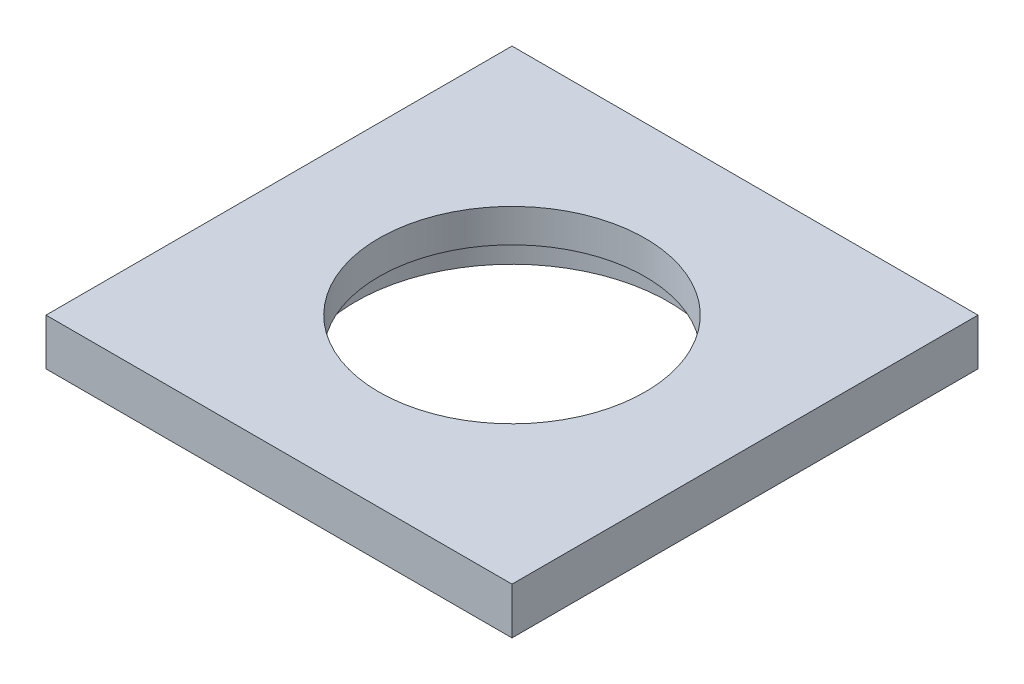
ISO-10303-21;
HEADER;
FILE_DESCRIPTION(('STEP AP214'),'2;1');
FILE_NAME('part.step','',(''),(''),'','','');
FILE_SCHEMA(('AUTOMOTIVE_DESIGN { 1 0 10303 214 1 1 1 1 }'));
ENDSEC;
DATA;
#1=APPLICATION_CONTEXT('core data for automotive mechanical design processes');
#2=APPLICATION_PROTOCOL_DEFINITION('international standard','automotive_design',2000,#1);
#3=PRODUCT_CONTEXT('',#1,'mechanical');
#4=PRODUCT('Part','Part','',(#3));
#5=PRODUCT_RELATED_PRODUCT_CATEGORY('part','',(#4));
#6=PRODUCT_DEFINITION_FORMATION('','',#4);
#7=PRODUCT_DEFINITION_CONTEXT('part definition',#1,'design');
#8=PRODUCT_DEFINITION('design','',#6,#7);
#9=PRODUCT_DEFINITION_SHAPE('','',#8);
#10=(LENGTH_UNIT() NAMED_UNIT(*) SI_UNIT(.MILLI.,.METRE.));
#11=(NAMED_UNIT(*) PLANE_ANGLE_UNIT() SI_UNIT($,.RADIAN.));
#12=(NAMED_UNIT(*) SI_UNIT($,.STERADIAN.) SOLID_ANGLE_UNIT());
#13=UNCERTAINTY_MEASURE_WITH_UNIT(LENGTH_MEASURE(1.E-05),#10,'distance_accuracy_value','');
#14=(GEOMETRIC_REPRESENTATION_CONTEXT(3) GLOBAL_UNCERTAINTY_ASSIGNED_CONTEXT((#13)) GLOBAL_UNIT_ASSIGNED_CONTEXT((#10,
#11,#12)) REPRESENTATION_CONTEXT('',''));
#15=CARTESIAN_POINT('',(0.,0.,0.));
#16=DIRECTION('',(0.,0.,1.));
#17=DIRECTION('',(1.,0.,0.));
#18=AXIS2_PLACEMENT_3D('',#15,#16,#17);
#19=CARTESIAN_POINT('',(0.,0.,0.));
#20=DIRECTION('',(0.,1.,0.));
#21=DIRECTION('',(0.,0.,1.));
#22=AXIS2_PLACEMENT_3D('',#19,#20,#21);
#23=PLANE('',#22);
#24=DIRECTION('',(0.,0.,-1.));
#25=VECTOR('',#24,1.);
#26=CARTESIAN_POINT('',(5.00000000000001,0.,0.));
#27=LINE('',#26,#25);
#28=CARTESIAN_POINT('',(5.,0.,-15.0000000000001));
#29=VERTEX_POINT('',#28);
#30=CARTESIAN_POINT('',(5.,0.,-54.9999999999999));
#31=VERTEX_POINT('',#30);
#32=EDGE_CURVE('E58',#29,#31,#27,.T.);
#33=ORIENTED_EDGE('',*,*,#32,.T.);
#34=CARTESIAN_POINT('',(15.,0.,-55.));
#35=DIRECTION('',(0.,1.,0.));
#36=DIRECTION('',(0.,0.,1.));
#37=AXIS2_PLACEMENT_3D('',#34,#35,#36);
#38=CIRCLE('',#37,10.);
#39=CARTESIAN_POINT('',(15.0000000000001,0.,-65.));
#40=VERTEX_POINT('',#39);
#41=EDGE_CURVE('E195',#31,#40,#38,.F.);
#42=ORIENTED_EDGE('',*,*,#41,.T.);
#43=DIRECTION('',(1.,0.,0.));
#44=VECTOR('',#43,1.);
#45=CARTESIAN_POINT('',(0.,0.,-65.));
#46=LINE('',#45,#44);
#47=CARTESIAN_POINT('',(54.9999999999999,0.,-65.));
#48=VERTEX_POINT('',#47);
#49=EDGE_CURVE('E199',#40,#48,#46,.T.);
#50=ORIENTED_EDGE('',*,*,#49,.T.);
#51=CARTESIAN_POINT('',(55.,0.,-55.));
#52=DIRECTION('',(0.,1.,0.));
#53=DIRECTION('',(0.,0.,1.));
#54=AXIS2_PLACEMENT_3D('',#51,#52,#53);
#55=CIRCLE('',#54,10.);
#56=CARTESIAN_POINT('',(65.,0.,-54.9999999999999));
#57=VERTEX_POINT('',#56);
#58=EDGE_CURVE('E202',#48,#57,#55,.F.);
#59=ORIENTED_EDGE('',*,*,#58,.T.);
#60=DIRECTION('',(0.,0.,1.));
#61=VECTOR('',#60,1.);
#62=CARTESIAN_POINT('',(65.,0.,0.));
#63=LINE('',#62,#61);
#64=CARTESIAN_POINT('',(65.,0.,-15.0000000000001));
#65=VERTEX_POINT('',#64);
#66=EDGE_CURVE('E205',#57,#65,#63,.T.);
#67=ORIENTED_EDGE('',*,*,#66,.T.);
#68=CARTESIAN_POINT('',(55.,0.,-15.));
#69=DIRECTION('',(0.,1.,0.));
#70=DIRECTION('',(0.,0.,1.));
#71=AXIS2_PLACEMENT_3D('',#68,#69,#70);
#72=CIRCLE('',#71,10.);
#73=CARTESIAN_POINT('',(54.9999999999999,0.,-4.99999999999999));
#74=VERTEX_POINT('',#73);
#75=EDGE_CURVE('E208',#65,#74,#72,.F.);
#76=ORIENTED_EDGE('',*,*,#75,.T.);
#77=DIRECTION('',(-1.,0.,0.));
#78=VECTOR('',#77,1.);
#79=CARTESIAN_POINT('',(0.,0.,-4.99999999999999));
#80=LINE('',#79,#78);
#81=CARTESIAN_POINT('',(15.0000000000001,0.,-4.99999999999999));
#82=VERTEX_POINT('',#81);
#83=EDGE_CURVE('E211',#74,#82,#80,.T.);
#84=ORIENTED_EDGE('',*,*,#83,.T.);
#85=CARTESIAN_POINT('',(15.,0.,-15.));
#86=DIRECTION('',(0.,1.,0.));
#87=DIRECTION('',(0.,0.,1.));
#88=AXIS2_PLACEMENT_3D('',#85,#86,#87);
#89=CIRCLE('',#88,10.);
#90=EDGE_CURVE('E138',#82,#29,#89,.F.);
#91=ORIENTED_EDGE('',*,*,#90,.T.);
#92=EDGE_LOOP('',(#33,#42,#50,#59,#67,#76,#84,#91));
#93=FACE_BOUND('',#92,.T.);
#94=CARTESIAN_POINT('',(35.,0.,-35.));
#95=DIRECTION('',(0.,1.,0.));
#96=DIRECTION('',(0.,0.,1.));
#97=AXIS2_PLACEMENT_3D('',#94,#95,#96);
#98=CIRCLE('',#97,23.5);
#99=CARTESIAN_POINT('',(35.,0.,-11.5));
#100=VERTEX_POINT('',#99);
#101=EDGE_CURVE('E397',#100,#100,#98,.T.);
#102=ORIENTED_EDGE('',*,*,#101,.T.);
#103=EDGE_LOOP('',(#102));
#104=FACE_BOUND('',#103,.T.);
#105=ADVANCED_FACE('F35',(#93,#104),#23,.F.);
#106=CARTESIAN_POINT('',(0.,10.,0.));
#107=DIRECTION('',(0.,0.,-1.));
#108=DIRECTION('',(-1.,0.,0.));
#109=AXIS2_PLACEMENT_3D('',#106,#107,#108);
#110=PLANE('',#109);
#111=DIRECTION('',(0.,-1.,0.));
#112=VECTOR('',#111,1.);
#113=CARTESIAN_POINT('',(0.,10.,0.));
#114=LINE('',#113,#112);
#115=CARTESIAN_POINT('',(0.,10.,0.));
#116=VERTEX_POINT('',#115);
#117=CARTESIAN_POINT('',(0.,3.,0.));
#118=VERTEX_POINT('',#117);
#119=EDGE_CURVE('E137',#116,#118,#114,.T.);
#120=ORIENTED_EDGE('',*,*,#119,.T.);
#121=DIRECTION('',(1.,0.,0.));
#122=VECTOR('',#121,1.);
#123=CARTESIAN_POINT('',(0.,3.,0.));
#124=LINE('',#123,#122);
#125=CARTESIAN_POINT('',(70.,3.,0.));
#126=VERTEX_POINT('',#125);
#127=EDGE_CURVE('E50',#118,#126,#124,.T.);
#128=ORIENTED_EDGE('',*,*,#127,.T.);
#129=DIRECTION('',(0.,-1.,0.));
#130=VECTOR('',#129,1.);
#131=CARTESIAN_POINT('',(70.,10.,0.));
#132=LINE('',#131,#130);
#133=CARTESIAN_POINT('',(70.,10.,0.));
#134=VERTEX_POINT('',#133);
#135=EDGE_CURVE('E11',#134,#126,#132,.T.);
#136=ORIENTED_EDGE('',*,*,#135,.F.);
#137=DIRECTION('',(1.,0.,0.));
#138=VECTOR('',#137,1.);
#139=CARTESIAN_POINT('',(0.,10.,0.));
#140=LINE('',#139,#138);
#141=EDGE_CURVE('E147',#116,#134,#140,.T.);
#142=ORIENTED_EDGE('',*,*,#141,.F.);
#143=EDGE_LOOP('',(#120,#128,#136,#142));
#144=FACE_BOUND('',#143,.T.);
#145=ADVANCED_FACE('F37',(#144),#110,.F.);
#146=CARTESIAN_POINT('',(70.,10.,0.));
#147=DIRECTION('',(-1.,0.,0.));
#148=DIRECTION('',(0.,0.,1.));
#149=AXIS2_PLACEMENT_3D('',#146,#147,#148);
#150=PLANE('',#149);
#151=ORIENTED_EDGE('',*,*,#135,.T.);
#152=DIRECTION('',(0.,0.,-1.));
#153=VECTOR('',#152,1.);
#154=CARTESIAN_POINT('',(70.,3.,0.));
#155=LINE('',#154,#153);
#156=CARTESIAN_POINT('',(70.,3.,-70.));
#157=VERTEX_POINT('',#156);
#158=EDGE_CURVE('E124',#126,#157,#155,.T.);
#159=ORIENTED_EDGE('',*,*,#158,.T.);
#160=DIRECTION('',(0.,-1.,0.));
#161=VECTOR('',#160,1.);
#162=CARTESIAN_POINT('',(70.,10.,-70.));
#163=LINE('',#162,#161);
#164=CARTESIAN_POINT('',(70.,10.,-70.));
#165=VERTEX_POINT('',#164);
#166=EDGE_CURVE('E43',#165,#157,#163,.T.);
#167=ORIENTED_EDGE('',*,*,#166,.F.);
#168=DIRECTION('',(0.,0.,-1.));
#169=VECTOR('',#168,1.);
#170=CARTESIAN_POINT('',(70.,10.,0.));
#171=LINE('',#170,#169);
#172=EDGE_CURVE('E141',#134,#165,#171,.T.);
#173=ORIENTED_EDGE('',*,*,#172,.F.);
#174=EDGE_LOOP('',(#151,#159,#167,#173));
#175=FACE_BOUND('',#174,.T.);
#176=ADVANCED_FACE('F140',(#175),#150,.F.);
#177=CARTESIAN_POINT('',(0.,10.,-70.));
#178=DIRECTION('',(0.,0.,-1.));
#179=DIRECTION('',(-1.,0.,0.));
#180=AXIS2_PLACEMENT_3D('',#177,#178,#179);
#181=PLANE('',#180);
#182=DIRECTION('',(1.,0.,0.));
#183=VECTOR('',#182,1.);
#184=CARTESIAN_POINT('',(0.,3.,-70.));
#185=LINE('',#184,#183);
#186=CARTESIAN_POINT('',(0.,3.,-70.));
#187=VERTEX_POINT('',#186);
#188=EDGE_CURVE('E128',#187,#157,#185,.T.);
#189=ORIENTED_EDGE('',*,*,#188,.F.);
#190=DIRECTION('',(0.,-1.,0.));
#191=VECTOR('',#190,1.);
#192=CARTESIAN_POINT('',(0.,10.,-70.));
#193=LINE('',#192,#191);
#194=CARTESIAN_POINT('',(0.,10.,-70.));
#195=VERTEX_POINT('',#194);
#196=EDGE_CURVE('E166',#195,#187,#193,.T.);
#197=ORIENTED_EDGE('',*,*,#196,.F.);
#198=DIRECTION('',(1.,0.,0.));
#199=VECTOR('',#198,1.);
#200=CARTESIAN_POINT('',(0.,10.,-70.));
#201=LINE('',#200,#199);
#202=EDGE_CURVE('E146',#195,#165,#201,.T.);
#203=ORIENTED_EDGE('',*,*,#202,.T.);
#204=ORIENTED_EDGE('',*,*,#166,.T.);
#205=EDGE_LOOP('',(#189,#197,#203,#204));
#206=FACE_BOUND('',#205,.T.);
#207=ADVANCED_FACE('F169',(#206),#181,.T.);
#208=CARTESIAN_POINT('',(0.,10.,0.));
#209=DIRECTION('',(-1.,0.,0.));
#210=DIRECTION('',(0.,0.,1.));
#211=AXIS2_PLACEMENT_3D('',#208,#209,#210);
#212=PLANE('',#211);
#213=DIRECTION('',(0.,0.,-1.));
#214=VECTOR('',#213,1.);
#215=CARTESIAN_POINT('',(0.,3.,0.));
#216=LINE('',#215,#214);
#217=EDGE_CURVE('E172',#118,#187,#216,.T.);
#218=ORIENTED_EDGE('',*,*,#217,.F.);
#219=ORIENTED_EDGE('',*,*,#119,.F.);
#220=DIRECTION('',(0.,0.,-1.));
#221=VECTOR('',#220,1.);
#222=CARTESIAN_POINT('',(0.,10.,0.));
#223=LINE('',#222,#221);
#224=EDGE_CURVE('E153',#116,#195,#223,.T.);
#225=ORIENTED_EDGE('',*,*,#224,.T.);
#226=ORIENTED_EDGE('',*,*,#196,.T.);
#227=EDGE_LOOP('',(#218,#219,#225,#226));
#228=FACE_BOUND('',#227,.T.);
#229=ADVANCED_FACE('F171',(#228),#212,.T.);
#230=CARTESIAN_POINT('',(35.,10.,-35.));
#231=DIRECTION('',(0.,-1.,0.));
#232=DIRECTION('',(0.,0.,-1.));
#233=AXIS2_PLACEMENT_3D('',#230,#231,#232);
#234=CYLINDRICAL_SURFACE('',#233,20.);
#235=CARTESIAN_POINT('',(35.,5.,-35.));
#236=DIRECTION('',(0.,1.,0.));
#237=DIRECTION('',(0.,0.,1.));
#238=AXIS2_PLACEMENT_3D('',#235,#236,#237);
#239=CIRCLE('',#238,20.);
#240=CARTESIAN_POINT('',(35.,5.,-15.));
#241=VERTEX_POINT('',#240);
#242=EDGE_CURVE('E393',#241,#241,#239,.T.);
#243=ORIENTED_EDGE('',*,*,#242,.F.);
#244=EDGE_LOOP('',(#243));
#245=FACE_BOUND('',#244,.T.);
#246=CARTESIAN_POINT('',(35.,10.,-35.));
#247=DIRECTION('',(0.,1.,0.));
#248=DIRECTION('',(0.,0.,1.));
#249=AXIS2_PLACEMENT_3D('',#246,#247,#248);
#250=CIRCLE('',#249,20.);
#251=CARTESIAN_POINT('',(35.,10.,-15.));
#252=VERTEX_POINT('',#251);
#253=EDGE_CURVE('E162',#252,#252,#250,.T.);
#254=ORIENTED_EDGE('',*,*,#253,.T.);
#255=EDGE_LOOP('',(#254));
#256=FACE_BOUND('',#255,.T.);
#257=ADVANCED_FACE('F279',(#245,#256),#234,.F.);
#258=CARTESIAN_POINT('',(0.,10.,0.));
#259=DIRECTION('',(0.,1.,0.));
#260=DIRECTION('',(0.,0.,1.));
#261=AXIS2_PLACEMENT_3D('',#258,#259,#260);
#262=PLANE('',#261);
#263=ORIENTED_EDGE('',*,*,#141,.T.);
#264=ORIENTED_EDGE('',*,*,#172,.T.);
#265=ORIENTED_EDGE('',*,*,#202,.F.);
#266=ORIENTED_EDGE('',*,*,#224,.F.);
#267=EDGE_LOOP('',(#263,#264,#265,#266));
#268=FACE_BOUND('',#267,.T.);
#269=ORIENTED_EDGE('',*,*,#253,.F.);
#270=EDGE_LOOP('',(#269));
#271=FACE_BOUND('',#270,.T.);
#272=ADVANCED_FACE('F150',(#268,#271),#262,.T.);
#273=CARTESIAN_POINT('',(5.00000000000001,3.,0.));
#274=DIRECTION('',(-1.,0.,0.));
#275=DIRECTION('',(0.,0.,1.));
#276=AXIS2_PLACEMENT_3D('',#273,#274,#275);
#277=PLANE('',#276);
#278=ORIENTED_EDGE('',*,*,#32,.F.);
#279=DIRECTION('',(0.,-1.,0.));
#280=VECTOR('',#279,1.);
#281=CARTESIAN_POINT('',(5.,3.,-15.0000000000001));
#282=LINE('',#281,#280);
#283=CARTESIAN_POINT('',(5.,3.,-15.0000000000001));
#284=VERTEX_POINT('',#283);
#285=EDGE_CURVE('E193',#284,#29,#282,.T.);
#286=ORIENTED_EDGE('',*,*,#285,.F.);
#287=DIRECTION('',(0.,0.,-1.));
#288=VECTOR('',#287,1.);
#289=CARTESIAN_POINT('',(5.00000000000001,3.,0.));
#290=LINE('',#289,#288);
#291=CARTESIAN_POINT('',(5.,3.,-54.9999999999999));
#292=VERTEX_POINT('',#291);
#293=EDGE_CURVE('E173',#284,#292,#290,.T.);
#294=ORIENTED_EDGE('',*,*,#293,.T.);
#295=DIRECTION('',(0.,-1.,0.));
#296=VECTOR('',#295,1.);
#297=CARTESIAN_POINT('',(5.,3.,-54.9999999999999));
#298=LINE('',#297,#296);
#299=EDGE_CURVE('E154',#292,#31,#298,.T.);
#300=ORIENTED_EDGE('',*,*,#299,.T.);
#301=EDGE_LOOP('',(#278,#286,#294,#300));
#302=FACE_BOUND('',#301,.T.);
#303=ADVANCED_FACE('F245',(#302),#277,.T.);
#304=CARTESIAN_POINT('',(15.,3.,-55.));
#305=DIRECTION('',(0.,-1.,0.));
#306=DIRECTION('',(0.,0.,-1.));
#307=AXIS2_PLACEMENT_3D('',#304,#305,#306);
#308=CYLINDRICAL_SURFACE('',#307,10.);
#309=ORIENTED_EDGE('',*,*,#41,.F.);
#310=ORIENTED_EDGE('',*,*,#299,.F.);
#311=CARTESIAN_POINT('',(15.,3.,-55.));
#312=DIRECTION('',(0.,1.,0.));
#313=DIRECTION('',(0.,0.,1.));
#314=AXIS2_PLACEMENT_3D('',#311,#312,#313);
#315=CIRCLE('',#314,10.);
#316=CARTESIAN_POINT('',(15.0000000000001,3.,-65.));
#317=VERTEX_POINT('',#316);
#318=EDGE_CURVE('E176',#292,#317,#315,.F.);
#319=ORIENTED_EDGE('',*,*,#318,.T.);
#320=DIRECTION('',(0.,-1.,0.));
#321=VECTOR('',#320,1.);
#322=CARTESIAN_POINT('',(15.0000000000001,3.,-65.));
#323=LINE('',#322,#321);
#324=EDGE_CURVE('E156',#317,#40,#323,.T.);
#325=ORIENTED_EDGE('',*,*,#324,.T.);
#326=EDGE_LOOP('',(#309,#310,#319,#325));
#327=FACE_BOUND('',#326,.T.);
#328=ADVANCED_FACE('F229',(#327),#308,.T.);
#329=CARTESIAN_POINT('',(0.,3.,-65.));
#330=DIRECTION('',(0.,0.,-1.));
#331=DIRECTION('',(-1.,0.,0.));
#332=AXIS2_PLACEMENT_3D('',#329,#330,#331);
#333=PLANE('',#332);
#334=ORIENTED_EDGE('',*,*,#49,.F.);
#335=ORIENTED_EDGE('',*,*,#324,.F.);
#336=DIRECTION('',(1.,0.,0.));
#337=VECTOR('',#336,1.);
#338=CARTESIAN_POINT('',(0.,3.,-65.));
#339=LINE('',#338,#337);
#340=CARTESIAN_POINT('',(54.9999999999999,3.,-65.));
#341=VERTEX_POINT('',#340);
#342=EDGE_CURVE('E181',#317,#341,#339,.T.);
#343=ORIENTED_EDGE('',*,*,#342,.T.);
#344=DIRECTION('',(0.,-1.,0.));
#345=VECTOR('',#344,1.);
#346=CARTESIAN_POINT('',(54.9999999999999,3.,-65.));
#347=LINE('',#346,#345);
#348=EDGE_CURVE('E225',#341,#48,#347,.T.);
#349=ORIENTED_EDGE('',*,*,#348,.T.);
#350=EDGE_LOOP('',(#334,#335,#343,#349));
#351=FACE_BOUND('',#350,.T.);
#352=ADVANCED_FACE('F233',(#351),#333,.T.);
#353=CARTESIAN_POINT('',(55.,3.,-55.));
#354=DIRECTION('',(0.,-1.,0.));
#355=DIRECTION('',(0.,0.,-1.));
#356=AXIS2_PLACEMENT_3D('',#353,#354,#355);
#357=CYLINDRICAL_SURFACE('',#356,10.);
#358=ORIENTED_EDGE('',*,*,#58,.F.);
#359=ORIENTED_EDGE('',*,*,#348,.F.);
#360=CARTESIAN_POINT('',(55.,3.,-55.));
#361=DIRECTION('',(0.,1.,0.));
#362=DIRECTION('',(0.,0.,1.));
#363=AXIS2_PLACEMENT_3D('',#360,#361,#362);
#364=CIRCLE('',#363,10.);
#365=CARTESIAN_POINT('',(65.,3.,-54.9999999999999));
#366=VERTEX_POINT('',#365);
#367=EDGE_CURVE('E183',#341,#366,#364,.F.);
#368=ORIENTED_EDGE('',*,*,#367,.T.);
#369=DIRECTION('',(0.,-1.,0.));
#370=VECTOR('',#369,1.);
#371=CARTESIAN_POINT('',(65.,3.,-54.9999999999999));
#372=LINE('',#371,#370);
#373=EDGE_CURVE('E223',#366,#57,#372,.T.);
#374=ORIENTED_EDGE('',*,*,#373,.T.);
#375=EDGE_LOOP('',(#358,#359,#368,#374));
#376=FACE_BOUND('',#375,.T.);
#377=ADVANCED_FACE('F250',(#376),#357,.T.);
#378=CARTESIAN_POINT('',(65.,3.,0.));
#379=DIRECTION('',(1.,0.,0.));
#380=DIRECTION('',(0.,0.,-1.));
#381=AXIS2_PLACEMENT_3D('',#378,#379,#380);
#382=PLANE('',#381);
#383=ORIENTED_EDGE('',*,*,#66,.F.);
#384=ORIENTED_EDGE('',*,*,#373,.F.);
#385=DIRECTION('',(0.,0.,1.));
#386=VECTOR('',#385,1.);
#387=CARTESIAN_POINT('',(65.,3.,0.));
#388=LINE('',#387,#386);
#389=CARTESIAN_POINT('',(65.,3.,-15.0000000000001));
#390=VERTEX_POINT('',#389);
#391=EDGE_CURVE('E185',#366,#390,#388,.T.);
#392=ORIENTED_EDGE('',*,*,#391,.T.);
#393=DIRECTION('',(0.,-1.,0.));
#394=VECTOR('',#393,1.);
#395=CARTESIAN_POINT('',(65.,3.,-15.0000000000001));
#396=LINE('',#395,#394);
#397=EDGE_CURVE('E221',#390,#65,#396,.T.);
#398=ORIENTED_EDGE('',*,*,#397,.T.);
#399=EDGE_LOOP('',(#383,#384,#392,#398));
#400=FACE_BOUND('',#399,.T.);
#401=ADVANCED_FACE('F255',(#400),#382,.T.);
#402=CARTESIAN_POINT('',(55.,3.,-15.));
#403=DIRECTION('',(0.,-1.,0.));
#404=DIRECTION('',(0.,0.,-1.));
#405=AXIS2_PLACEMENT_3D('',#402,#403,#404);
#406=CYLINDRICAL_SURFACE('',#405,10.);
#407=ORIENTED_EDGE('',*,*,#75,.F.);
#408=ORIENTED_EDGE('',*,*,#397,.F.);
#409=CARTESIAN_POINT('',(55.,3.,-15.));
#410=DIRECTION('',(0.,1.,0.));
#411=DIRECTION('',(0.,0.,1.));
#412=AXIS2_PLACEMENT_3D('',#409,#410,#411);
#413=CIRCLE('',#412,10.);
#414=CARTESIAN_POINT('',(54.9999999999999,3.,-4.99999999999999));
#415=VERTEX_POINT('',#414);
#416=EDGE_CURVE('E187',#390,#415,#413,.F.);
#417=ORIENTED_EDGE('',*,*,#416,.T.);
#418=DIRECTION('',(0.,-1.,0.));
#419=VECTOR('',#418,1.);
#420=CARTESIAN_POINT('',(54.9999999999999,3.,-4.99999999999999));
#421=LINE('',#420,#419);
#422=EDGE_CURVE('E219',#415,#74,#421,.T.);
#423=ORIENTED_EDGE('',*,*,#422,.T.);
#424=EDGE_LOOP('',(#407,#408,#417,#423));
#425=FACE_BOUND('',#424,.T.);
#426=ADVANCED_FACE('F259',(#425),#406,.T.);
#427=CARTESIAN_POINT('',(0.,3.,-4.99999999999999));
#428=DIRECTION('',(0.,0.,1.));
#429=DIRECTION('',(1.,0.,0.));
#430=AXIS2_PLACEMENT_3D('',#427,#428,#429);
#431=PLANE('',#430);
#432=ORIENTED_EDGE('',*,*,#83,.F.);
#433=ORIENTED_EDGE('',*,*,#422,.F.);
#434=DIRECTION('',(-1.,0.,0.));
#435=VECTOR('',#434,1.);
#436=CARTESIAN_POINT('',(0.,3.,-4.99999999999999));
#437=LINE('',#436,#435);
#438=CARTESIAN_POINT('',(15.0000000000001,3.,-4.99999999999999));
#439=VERTEX_POINT('',#438);
#440=EDGE_CURVE('E189',#415,#439,#437,.T.);
#441=ORIENTED_EDGE('',*,*,#440,.T.);
#442=DIRECTION('',(0.,-1.,0.));
#443=VECTOR('',#442,1.);
#444=CARTESIAN_POINT('',(15.0000000000001,3.,-4.99999999999999));
#445=LINE('',#444,#443);
#446=EDGE_CURVE('E217',#439,#82,#445,.T.);
#447=ORIENTED_EDGE('',*,*,#446,.T.);
#448=EDGE_LOOP('',(#432,#433,#441,#447));
#449=FACE_BOUND('',#448,.T.);
#450=ADVANCED_FACE('F262',(#449),#431,.T.);
#451=CARTESIAN_POINT('',(15.,3.,-15.));
#452=DIRECTION('',(0.,-1.,0.));
#453=DIRECTION('',(0.,0.,-1.));
#454=AXIS2_PLACEMENT_3D('',#451,#452,#453);
#455=CYLINDRICAL_SURFACE('',#454,10.);
#456=ORIENTED_EDGE('',*,*,#90,.F.);
#457=ORIENTED_EDGE('',*,*,#446,.F.);
#458=CARTESIAN_POINT('',(15.,3.,-15.));
#459=DIRECTION('',(0.,1.,0.));
#460=DIRECTION('',(0.,0.,1.));
#461=AXIS2_PLACEMENT_3D('',#458,#459,#460);
#462=CIRCLE('',#461,10.);
#463=EDGE_CURVE('E191',#439,#284,#462,.F.);
#464=ORIENTED_EDGE('',*,*,#463,.T.);
#465=ORIENTED_EDGE('',*,*,#285,.T.);
#466=EDGE_LOOP('',(#456,#457,#464,#465));
#467=FACE_BOUND('',#466,.T.);
#468=ADVANCED_FACE('F242',(#467),#455,.T.);
#469=CARTESIAN_POINT('',(0.,3.,0.));
#470=DIRECTION('',(0.,1.,0.));
#471=DIRECTION('',(0.,0.,1.));
#472=AXIS2_PLACEMENT_3D('',#469,#470,#471);
#473=PLANE('',#472);
#474=ORIENTED_EDGE('',*,*,#127,.F.);
#475=ORIENTED_EDGE('',*,*,#217,.T.);
#476=ORIENTED_EDGE('',*,*,#188,.T.);
#477=ORIENTED_EDGE('',*,*,#158,.F.);
#478=EDGE_LOOP('',(#474,#475,#476,#477));
#479=FACE_BOUND('',#478,.T.);
#480=ORIENTED_EDGE('',*,*,#293,.F.);
#481=ORIENTED_EDGE('',*,*,#463,.F.);
#482=ORIENTED_EDGE('',*,*,#440,.F.);
#483=ORIENTED_EDGE('',*,*,#416,.F.);
#484=ORIENTED_EDGE('',*,*,#391,.F.);
#485=ORIENTED_EDGE('',*,*,#367,.F.);
#486=ORIENTED_EDGE('',*,*,#342,.F.);
#487=ORIENTED_EDGE('',*,*,#318,.F.);
#488=EDGE_LOOP('',(#480,#481,#482,#483,#484,#485,#486,#487));
#489=FACE_BOUND('',#488,.T.);
#490=ADVANCED_FACE('F125',(#479,#489),#473,.F.);
#491=CARTESIAN_POINT('',(35.,5.,-35.));
#492=DIRECTION('',(0.,-1.,0.));
#493=DIRECTION('',(0.,0.,-1.));
#494=AXIS2_PLACEMENT_3D('',#491,#492,#493);
#495=CYLINDRICAL_SURFACE('',#494,23.5);
#496=CARTESIAN_POINT('',(35.,5.,-35.));
#497=DIRECTION('',(0.,1.,0.));
#498=DIRECTION('',(0.,0.,1.));
#499=AXIS2_PLACEMENT_3D('',#496,#497,#498);
#500=CIRCLE('',#499,23.5);
#501=CARTESIAN_POINT('',(35.,5.,-11.5));
#502=VERTEX_POINT('',#501);
#503=EDGE_CURVE('E196',#502,#502,#500,.T.);
#504=ORIENTED_EDGE('',*,*,#503,.T.);
#505=EDGE_LOOP('',(#504));
#506=FACE_BOUND('',#505,.T.);
#507=ORIENTED_EDGE('',*,*,#101,.F.);
#508=EDGE_LOOP('',(#507));
#509=FACE_BOUND('',#508,.T.);
#510=ADVANCED_FACE('F360',(#506,#509),#495,.F.);
#511=CARTESIAN_POINT('',(0.,5.,0.));
#512=DIRECTION('',(0.,1.,0.));
#513=DIRECTION('',(0.,0.,1.));
#514=AXIS2_PLACEMENT_3D('',#511,#512,#513);
#515=PLANE('',#514);
#516=ORIENTED_EDGE('',*,*,#242,.T.);
#517=EDGE_LOOP('',(#516));
#518=FACE_BOUND('',#517,.T.);
#519=ORIENTED_EDGE('',*,*,#503,.F.);
#520=EDGE_LOOP('',(#519));
#521=FACE_BOUND('',#520,.T.);
#522=ADVANCED_FACE('F377',(#518,#521),#515,.F.);
#523=CLOSED_SHELL('',(#105,#145,#176,#207,#229,#257,#272,#303,#328,#352,#377,#401,#426,#450,
#468,#490,#510,#522));
#524=MANIFOLD_SOLID_BREP('B2',#523);
#525=ADVANCED_BREP_SHAPE_REPRESENTATION('',(#18,#524),#14);
#526=SHAPE_DEFINITION_REPRESENTATION(#9,#525);
ENDSEC;
END-ISO-10303-21;
